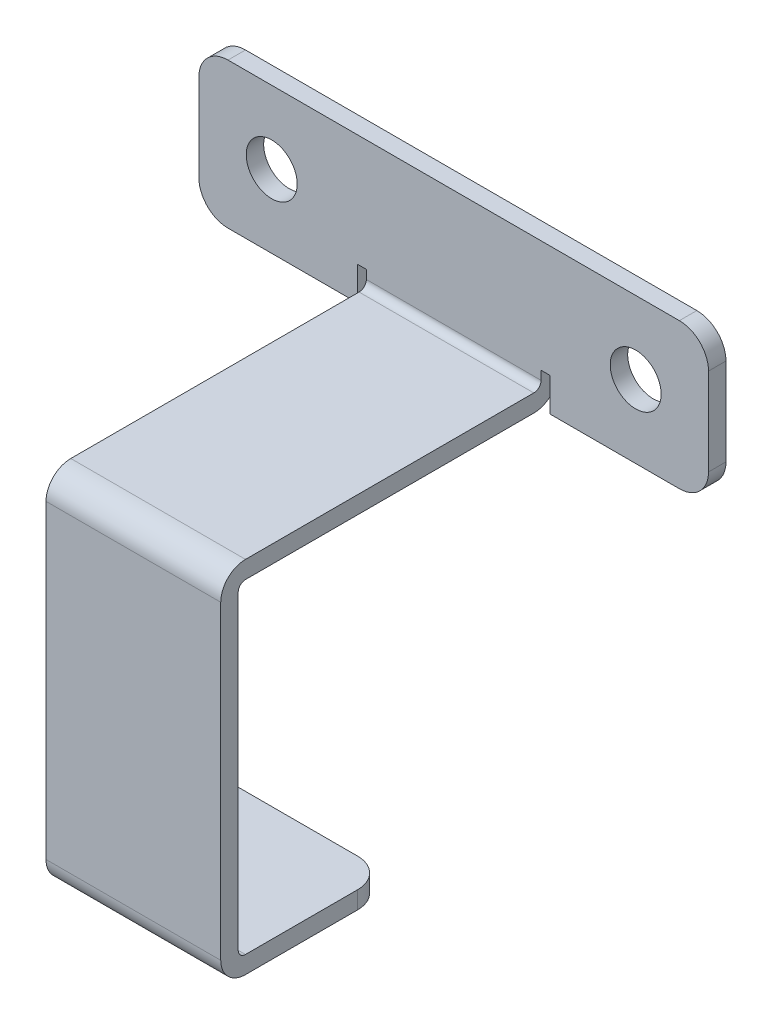
ISO-10303-21;
HEADER;
FILE_DESCRIPTION(('STEP AP214'),'2;1');
FILE_NAME('part.step','',(''),(''),'','','');
FILE_SCHEMA(('AUTOMOTIVE_DESIGN { 1 0 10303 214 1 1 1 1 }'));
ENDSEC;
DATA;
#1=APPLICATION_CONTEXT('core data for automotive mechanical design processes');
#2=APPLICATION_PROTOCOL_DEFINITION('international standard','automotive_design',2000,#1);
#3=PRODUCT_CONTEXT('',#1,'mechanical');
#4=PRODUCT('Part','Part','',(#3));
#5=PRODUCT_RELATED_PRODUCT_CATEGORY('part','',(#4));
#6=PRODUCT_DEFINITION_FORMATION('','',#4);
#7=PRODUCT_DEFINITION_CONTEXT('part definition',#1,'design');
#8=PRODUCT_DEFINITION('design','',#6,#7);
#9=PRODUCT_DEFINITION_SHAPE('','',#8);
#10=(LENGTH_UNIT() NAMED_UNIT(*) SI_UNIT(.MILLI.,.METRE.));
#11=(NAMED_UNIT(*) PLANE_ANGLE_UNIT() SI_UNIT($,.RADIAN.));
#12=(NAMED_UNIT(*) SI_UNIT($,.STERADIAN.) SOLID_ANGLE_UNIT());
#13=UNCERTAINTY_MEASURE_WITH_UNIT(LENGTH_MEASURE(1.E-05),#10,'distance_accuracy_value','');
#14=(GEOMETRIC_REPRESENTATION_CONTEXT(3) GLOBAL_UNCERTAINTY_ASSIGNED_CONTEXT((#13)) GLOBAL_UNIT_ASSIGNED_CONTEXT((#10,
#11,#12)) REPRESENTATION_CONTEXT('',''));
#15=CARTESIAN_POINT('',(0.,0.,0.));
#16=DIRECTION('',(0.,0.,1.));
#17=DIRECTION('',(1.,0.,0.));
#18=AXIS2_PLACEMENT_3D('',#15,#16,#17);
#19=CARTESIAN_POINT('',(5.9999999999994,-26.8,21.5));
#20=DIRECTION('',(-1.,1.20042864537595E-12,1.20042864537596E-12));
#21=DIRECTION('',(1.20042864537596E-12,0.,1.));
#22=AXIS2_PLACEMENT_3D('',#19,#20,#21);
#23=CYLINDRICAL_SURFACE('',#22,0.5);
#24=CARTESIAN_POINT('',(-5.9999999999994,-26.7999999999856,21.5000000000144));
#25=DIRECTION('',(1.,-1.20042864537595E-12,-1.20042864537596E-12));
#26=DIRECTION('',(1.20042864537596E-12,0.,1.));
#27=AXIS2_PLACEMENT_3D('',#24,#25,#26);
#28=CIRCLE('',#27,0.5);
#29=CARTESIAN_POINT('',(-5.9999999999994,-26.7999999999928,22.));
#30=VERTEX_POINT('',#29);
#31=CARTESIAN_POINT('',(-6.,-27.3,21.5000000000072));
#32=VERTEX_POINT('',#31);
#33=EDGE_CURVE('E455',#30,#32,#28,.T.);
#34=ORIENTED_EDGE('',*,*,#33,.F.);
#35=DIRECTION('',(-1.,0.,0.));
#36=VECTOR('',#35,1.);
#37=CARTESIAN_POINT('',(0.,-26.8,22.));
#38=LINE('',#37,#36);
#39=CARTESIAN_POINT('',(6.,-26.8,22.));
#40=VERTEX_POINT('',#39);
#41=EDGE_CURVE('E20',#40,#30,#38,.T.);
#42=ORIENTED_EDGE('',*,*,#41,.F.);
#43=CARTESIAN_POINT('',(5.9999999999994,-26.8,21.5));
#44=DIRECTION('',(-1.,1.20042864537595E-12,1.20042864537596E-12));
#45=DIRECTION('',(1.20042864537596E-12,0.,1.));
#46=AXIS2_PLACEMENT_3D('',#43,#44,#45);
#47=CIRCLE('',#46,0.5);
#48=CARTESIAN_POINT('',(5.9999999999994,-27.3,21.5));
#49=VERTEX_POINT('',#48);
#50=EDGE_CURVE('E541',#49,#40,#47,.T.);
#51=ORIENTED_EDGE('',*,*,#50,.F.);
#52=DIRECTION('',(1.,0.,0.));
#53=VECTOR('',#52,1.);
#54=CARTESIAN_POINT('',(0.,-27.3,21.5));
#55=LINE('',#54,#53);
#56=EDGE_CURVE('E343',#32,#49,#55,.T.);
#57=ORIENTED_EDGE('',*,*,#56,.F.);
#58=EDGE_LOOP('',(#34,#42,#51,#57));
#59=FACE_BOUND('',#58,.T.);
#60=ADVANCED_FACE('F17',(#59),#23,.F.);
#61=CARTESIAN_POINT('',(-4.,-28.5,13.7999999999994));
#62=DIRECTION('',(0.,1.,0.));
#63=DIRECTION('',(0.,0.,1.));
#64=AXIS2_PLACEMENT_3D('',#61,#62,#63);
#65=CYLINDRICAL_SURFACE('',#64,1.99999999999972);
#66=CARTESIAN_POINT('',(-4.,-27.3,13.7999999999994));
#67=DIRECTION('',(0.,1.,0.));
#68=DIRECTION('',(0.,0.,1.));
#69=AXIS2_PLACEMENT_3D('',#66,#67,#68);
#70=CIRCLE('',#69,1.99999999999972);
#71=CARTESIAN_POINT('',(-4.,-27.3,11.8));
#72=VERTEX_POINT('',#71);
#73=CARTESIAN_POINT('',(-6.,-27.3,13.7999999999997));
#74=VERTEX_POINT('',#73);
#75=EDGE_CURVE('E347',#72,#74,#70,.T.);
#76=ORIENTED_EDGE('',*,*,#75,.F.);
#77=DIRECTION('',(0.,-1.,0.));
#78=VECTOR('',#77,1.);
#79=CARTESIAN_POINT('',(-4.,-27.9,11.8));
#80=LINE('',#79,#78);
#81=CARTESIAN_POINT('',(-4.,-28.5,11.8));
#82=VERTEX_POINT('',#81);
#83=EDGE_CURVE('E11',#72,#82,#80,.T.);
#84=ORIENTED_EDGE('',*,*,#83,.T.);
#85=CARTESIAN_POINT('',(-4.,-28.5,13.7999999999994));
#86=DIRECTION('',(0.,1.,0.));
#87=DIRECTION('',(0.,0.,1.));
#88=AXIS2_PLACEMENT_3D('',#85,#86,#87);
#89=CIRCLE('',#88,1.99999999999972);
#90=CARTESIAN_POINT('',(-6.,-28.5,13.7999999999997));
#91=VERTEX_POINT('',#90);
#92=EDGE_CURVE('E381',#82,#91,#89,.T.);
#93=ORIENTED_EDGE('',*,*,#92,.T.);
#94=DIRECTION('',(0.,1.,0.));
#95=VECTOR('',#94,1.);
#96=CARTESIAN_POINT('',(-6.,-27.9,13.8));
#97=LINE('',#96,#95);
#98=EDGE_CURVE('E471',#91,#74,#97,.T.);
#99=ORIENTED_EDGE('',*,*,#98,.T.);
#100=EDGE_LOOP('',(#76,#84,#93,#99));
#101=FACE_BOUND('',#100,.T.);
#102=ADVANCED_FACE('F588',(#101),#65,.T.);
#103=CARTESIAN_POINT('',(4.,-28.5,13.7999999999994));
#104=DIRECTION('',(0.,1.,0.));
#105=DIRECTION('',(0.,0.,1.));
#106=AXIS2_PLACEMENT_3D('',#103,#104,#105);
#107=CYLINDRICAL_SURFACE('',#106,1.99999999999972);
#108=CARTESIAN_POINT('',(4.,-27.3,13.7999999999994));
#109=DIRECTION('',(0.,1.,0.));
#110=DIRECTION('',(0.,0.,1.));
#111=AXIS2_PLACEMENT_3D('',#108,#109,#110);
#112=CIRCLE('',#111,1.99999999999972);
#113=CARTESIAN_POINT('',(6.,-27.3,13.7999999999997));
#114=VERTEX_POINT('',#113);
#115=CARTESIAN_POINT('',(4.,-27.3,11.8));
#116=VERTEX_POINT('',#115);
#117=EDGE_CURVE('E346',#114,#116,#112,.T.);
#118=ORIENTED_EDGE('',*,*,#117,.F.);
#119=DIRECTION('',(0.,-1.,0.));
#120=VECTOR('',#119,1.);
#121=CARTESIAN_POINT('',(6.,-27.9,13.8));
#122=LINE('',#121,#120);
#123=CARTESIAN_POINT('',(6.,-28.5,13.7999999999997));
#124=VERTEX_POINT('',#123);
#125=EDGE_CURVE('E566',#114,#124,#122,.T.);
#126=ORIENTED_EDGE('',*,*,#125,.T.);
#127=CARTESIAN_POINT('',(4.,-28.5,13.7999999999994));
#128=DIRECTION('',(0.,1.,0.));
#129=DIRECTION('',(0.,0.,1.));
#130=AXIS2_PLACEMENT_3D('',#127,#128,#129);
#131=CIRCLE('',#130,1.99999999999972);
#132=CARTESIAN_POINT('',(4.,-28.5,11.8));
#133=VERTEX_POINT('',#132);
#134=EDGE_CURVE('E378',#124,#133,#131,.T.);
#135=ORIENTED_EDGE('',*,*,#134,.T.);
#136=DIRECTION('',(0.,1.,0.));
#137=VECTOR('',#136,1.);
#138=CARTESIAN_POINT('',(4.,-27.9,11.8));
#139=LINE('',#138,#137);
#140=EDGE_CURVE('E26',#133,#116,#139,.T.);
#141=ORIENTED_EDGE('',*,*,#140,.T.);
#142=EDGE_LOOP('',(#118,#126,#135,#141));
#143=FACE_BOUND('',#142,.T.);
#144=ADVANCED_FACE('F1411',(#143),#107,.T.);
#145=CARTESIAN_POINT('',(-4.,-27.3,11.8));
#146=DIRECTION('',(0.,0.,1.));
#147=DIRECTION('',(1.,0.,0.));
#148=AXIS2_PLACEMENT_3D('',#145,#146,#147);
#149=PLANE('',#148);
#150=ORIENTED_EDGE('',*,*,#140,.F.);
#151=DIRECTION('',(-1.,0.,0.));
#152=VECTOR('',#151,1.);
#153=CARTESIAN_POINT('',(0.,-28.5,11.8));
#154=LINE('',#153,#152);
#155=EDGE_CURVE('E387',#133,#82,#154,.T.);
#156=ORIENTED_EDGE('',*,*,#155,.T.);
#157=ORIENTED_EDGE('',*,*,#83,.F.);
#158=DIRECTION('',(-1.,0.,0.));
#159=VECTOR('',#158,1.);
#160=CARTESIAN_POINT('',(0.,-27.3,11.8));
#161=LINE('',#160,#159);
#162=EDGE_CURVE('E383',#116,#72,#161,.T.);
#163=ORIENTED_EDGE('',*,*,#162,.F.);
#164=EDGE_LOOP('',(#150,#156,#157,#163));
#165=FACE_BOUND('',#164,.T.);
#166=ADVANCED_FACE('F1402',(#165),#149,.F.);
#167=CARTESIAN_POINT('',(5.9999999999994,-5.5,21.5));
#168=DIRECTION('',(-1.,1.20042864537619E-12,1.20042864537584E-12));
#169=DIRECTION('',(1.20042864537584E-12,0.,1.));
#170=AXIS2_PLACEMENT_3D('',#167,#168,#169);
#171=CYLINDRICAL_SURFACE('',#170,0.500000000000046);
#172=CARTESIAN_POINT('',(-6.0000000000006,-5.4999999999856,21.5000000000143));
#173=DIRECTION('',(1.,-1.20042864537619E-12,-1.20042864537584E-12));
#174=DIRECTION('',(1.20042864537584E-12,0.,1.));
#175=AXIS2_PLACEMENT_3D('',#172,#173,#174);
#176=CIRCLE('',#175,0.500000000000046);
#177=CARTESIAN_POINT('',(-6.,-5.,21.5000000000071));
#178=VERTEX_POINT('',#177);
#179=CARTESIAN_POINT('',(-6.,-5.4999999999928,22.));
#180=VERTEX_POINT('',#179);
#181=EDGE_CURVE('E456',#178,#180,#176,.T.);
#182=ORIENTED_EDGE('',*,*,#181,.F.);
#183=DIRECTION('',(1.,0.,0.));
#184=VECTOR('',#183,1.);
#185=CARTESIAN_POINT('',(0.,-5.,21.5));
#186=LINE('',#185,#184);
#187=CARTESIAN_POINT('',(6.,-5.,21.5));
#188=VERTEX_POINT('',#187);
#189=EDGE_CURVE('E547',#178,#188,#186,.T.);
#190=ORIENTED_EDGE('',*,*,#189,.T.);
#191=CARTESIAN_POINT('',(5.9999999999994,-5.5,21.5));
#192=DIRECTION('',(-1.,1.20042864537619E-12,1.20042864537584E-12));
#193=DIRECTION('',(1.20042864537584E-12,0.,1.));
#194=AXIS2_PLACEMENT_3D('',#191,#192,#193);
#195=CIRCLE('',#194,0.500000000000046);
#196=CARTESIAN_POINT('',(6.,-5.5,22.));
#197=VERTEX_POINT('',#196);
#198=EDGE_CURVE('E551',#197,#188,#195,.T.);
#199=ORIENTED_EDGE('',*,*,#198,.F.);
#200=DIRECTION('',(1.,0.,0.));
#201=VECTOR('',#200,1.);
#202=CARTESIAN_POINT('',(0.,-5.5,22.));
#203=LINE('',#202,#201);
#204=EDGE_CURVE('E422',#180,#197,#203,.T.);
#205=ORIENTED_EDGE('',*,*,#204,.F.);
#206=EDGE_LOOP('',(#182,#190,#199,#205));
#207=FACE_BOUND('',#206,.T.);
#208=ADVANCED_FACE('F1393',(#207),#171,.F.);
#209=CARTESIAN_POINT('',(6.,-26.8,22.));
#210=DIRECTION('',(0.,0.,-1.));
#211=DIRECTION('',(0.,-1.,0.));
#212=AXIS2_PLACEMENT_3D('',#209,#210,#211);
#213=PLANE('',#212);
#214=DIRECTION('',(0.,-1.,0.));
#215=VECTOR('',#214,1.);
#216=CARTESIAN_POINT('',(-6.,-15.6,22.));
#217=LINE('',#216,#215);
#218=EDGE_CURVE('E451',#180,#30,#217,.T.);
#219=ORIENTED_EDGE('',*,*,#218,.F.);
#220=ORIENTED_EDGE('',*,*,#204,.T.);
#221=DIRECTION('',(0.,1.,0.));
#222=VECTOR('',#221,1.);
#223=CARTESIAN_POINT('',(6.,-15.6,22.));
#224=LINE('',#223,#222);
#225=EDGE_CURVE('E338',#40,#197,#224,.T.);
#226=ORIENTED_EDGE('',*,*,#225,.F.);
#227=ORIENTED_EDGE('',*,*,#41,.T.);
#228=EDGE_LOOP('',(#219,#220,#226,#227));
#229=FACE_BOUND('',#228,.T.);
#230=ADVANCED_FACE('F1219',(#229),#213,.T.);
#231=CARTESIAN_POINT('',(-6.,-27.3,11.8));
#232=DIRECTION('',(0.,1.,0.));
#233=DIRECTION('',(1.,0.,0.));
#234=AXIS2_PLACEMENT_3D('',#231,#232,#233);
#235=PLANE('',#234);
#236=ORIENTED_EDGE('',*,*,#162,.T.);
#237=ORIENTED_EDGE('',*,*,#75,.T.);
#238=DIRECTION('',(0.,0.,-1.));
#239=VECTOR('',#238,1.);
#240=CARTESIAN_POINT('',(-6.,-27.3,11.6));
#241=LINE('',#240,#239);
#242=EDGE_CURVE('E467',#32,#74,#241,.T.);
#243=ORIENTED_EDGE('',*,*,#242,.F.);
#244=ORIENTED_EDGE('',*,*,#56,.T.);
#245=DIRECTION('',(0.,0.,1.));
#246=VECTOR('',#245,1.);
#247=CARTESIAN_POINT('',(6.,-27.3,11.6));
#248=LINE('',#247,#246);
#249=EDGE_CURVE('E562',#114,#49,#248,.T.);
#250=ORIENTED_EDGE('',*,*,#249,.F.);
#251=ORIENTED_EDGE('',*,*,#117,.T.);
#252=EDGE_LOOP('',(#236,#237,#243,#244,#250,#251));
#253=FACE_BOUND('',#252,.T.);
#254=ADVANCED_FACE('F585',(#253),#235,.T.);
#255=CARTESIAN_POINT('',(-6.,-28.5,11.8));
#256=DIRECTION('',(0.,1.,0.));
#257=DIRECTION('',(1.,0.,0.));
#258=AXIS2_PLACEMENT_3D('',#255,#256,#257);
#259=PLANE('',#258);
#260=ORIENTED_EDGE('',*,*,#134,.F.);
#261=DIRECTION('',(0.,0.,-1.));
#262=VECTOR('',#261,1.);
#263=CARTESIAN_POINT('',(6.,-28.5,11.6));
#264=LINE('',#263,#262);
#265=CARTESIAN_POINT('',(6.,-28.5,21.5));
#266=VERTEX_POINT('',#265);
#267=EDGE_CURVE('E514',#266,#124,#264,.T.);
#268=ORIENTED_EDGE('',*,*,#267,.F.);
#269=DIRECTION('',(1.,0.,0.));
#270=VECTOR('',#269,1.);
#271=CARTESIAN_POINT('',(0.,-28.5,21.5));
#272=LINE('',#271,#270);
#273=CARTESIAN_POINT('',(-6.0000000000006,-28.5,21.5000000000021));
#274=VERTEX_POINT('',#273);
#275=EDGE_CURVE('E382',#274,#266,#272,.T.);
#276=ORIENTED_EDGE('',*,*,#275,.F.);
#277=DIRECTION('',(0.,0.,1.));
#278=VECTOR('',#277,1.);
#279=CARTESIAN_POINT('',(-6.,-28.5,11.6));
#280=LINE('',#279,#278);
#281=EDGE_CURVE('E533',#91,#274,#280,.T.);
#282=ORIENTED_EDGE('',*,*,#281,.F.);
#283=ORIENTED_EDGE('',*,*,#92,.F.);
#284=ORIENTED_EDGE('',*,*,#155,.F.);
#285=EDGE_LOOP('',(#260,#268,#276,#282,#283,#284));
#286=FACE_BOUND('',#285,.T.);
#287=ADVANCED_FACE('F1218',(#286),#259,.F.);
#288=CARTESIAN_POINT('',(5.9999999999994,-26.8,21.5));
#289=DIRECTION('',(-1.,3.53067248639986E-13,3.53067248639986E-13));
#290=DIRECTION('',(3.53067248639986E-13,0.,1.));
#291=AXIS2_PLACEMENT_3D('',#288,#289,#290);
#292=CYLINDRICAL_SURFACE('',#291,1.7);
#293=ORIENTED_EDGE('',*,*,#275,.T.);
#294=CARTESIAN_POINT('',(6.0000000000006,-26.8,21.5));
#295=DIRECTION('',(1.,-3.53067248639986E-13,-3.53067248639986E-13));
#296=DIRECTION('',(3.53067248639986E-13,0.,1.));
#297=AXIS2_PLACEMENT_3D('',#294,#295,#296);
#298=CIRCLE('',#297,1.7);
#299=CARTESIAN_POINT('',(6.0000000000006,-26.8,23.2));
#300=VERTEX_POINT('',#299);
#301=EDGE_CURVE('E479',#300,#266,#298,.T.);
#302=ORIENTED_EDGE('',*,*,#301,.F.);
#303=DIRECTION('',(-1.,0.,0.));
#304=VECTOR('',#303,1.);
#305=CARTESIAN_POINT('',(0.,-26.8,23.2));
#306=LINE('',#305,#304);
#307=CARTESIAN_POINT('',(-6.,-26.7999999999979,23.2));
#308=VERTEX_POINT('',#307);
#309=EDGE_CURVE('E439',#300,#308,#306,.T.);
#310=ORIENTED_EDGE('',*,*,#309,.T.);
#311=CARTESIAN_POINT('',(-6.0000000000006,-26.7999999999958,21.5000000000042));
#312=DIRECTION('',(-1.,3.53067248639986E-13,3.53067248639986E-13));
#313=DIRECTION('',(3.53067248639986E-13,0.,1.));
#314=AXIS2_PLACEMENT_3D('',#311,#312,#313);
#315=CIRCLE('',#314,1.7);
#316=EDGE_CURVE('E534',#274,#308,#315,.T.);
#317=ORIENTED_EDGE('',*,*,#316,.F.);
#318=EDGE_LOOP('',(#293,#302,#310,#317));
#319=FACE_BOUND('',#318,.T.);
#320=ADVANCED_FACE('F1368',(#319),#292,.T.);
#321=CARTESIAN_POINT('',(6.,-26.8,23.2));
#322=DIRECTION('',(0.,0.,-1.));
#323=DIRECTION('',(0.,-1.,0.));
#324=AXIS2_PLACEMENT_3D('',#321,#322,#323);
#325=PLANE('',#324);
#326=DIRECTION('',(0.,1.,0.));
#327=VECTOR('',#326,1.);
#328=CARTESIAN_POINT('',(-6.,-15.6,23.2));
#329=LINE('',#328,#327);
#330=CARTESIAN_POINT('',(-6.,-5.49999999999788,23.2));
#331=VERTEX_POINT('',#330);
#332=EDGE_CURVE('E497',#308,#331,#329,.T.);
#333=ORIENTED_EDGE('',*,*,#332,.F.);
#334=ORIENTED_EDGE('',*,*,#309,.F.);
#335=DIRECTION('',(0.,-1.,0.));
#336=VECTOR('',#335,1.);
#337=CARTESIAN_POINT('',(6.,-15.6,23.2));
#338=LINE('',#337,#336);
#339=CARTESIAN_POINT('',(6.,-5.5,23.2));
#340=VERTEX_POINT('',#339);
#341=EDGE_CURVE('E475',#340,#300,#338,.T.);
#342=ORIENTED_EDGE('',*,*,#341,.F.);
#343=DIRECTION('',(1.,0.,0.));
#344=VECTOR('',#343,1.);
#345=CARTESIAN_POINT('',(0.,-5.5,23.2));
#346=LINE('',#345,#344);
#347=EDGE_CURVE('E572',#331,#340,#346,.T.);
#348=ORIENTED_EDGE('',*,*,#347,.F.);
#349=EDGE_LOOP('',(#333,#334,#342,#348));
#350=FACE_BOUND('',#349,.T.);
#351=ADVANCED_FACE('F1359',(#350),#325,.F.);
#352=CARTESIAN_POINT('',(5.9999999999994,-5.5,21.5));
#353=DIRECTION('',(-1.,3.53067248639997E-13,3.53067248639986E-13));
#354=DIRECTION('',(-3.53067248639997E-13,-1.,0.));
#355=AXIS2_PLACEMENT_3D('',#352,#353,#354);
#356=CYLINDRICAL_SURFACE('',#355,1.69999999999995);
#357=ORIENTED_EDGE('',*,*,#347,.T.);
#358=CARTESIAN_POINT('',(5.9999999999994,-5.5,21.5));
#359=DIRECTION('',(1.,-3.53067248639997E-13,-3.53067248639986E-13));
#360=DIRECTION('',(-3.53067248639997E-13,-1.,0.));
#361=AXIS2_PLACEMENT_3D('',#358,#359,#360);
#362=CIRCLE('',#361,1.69999999999995);
#363=CARTESIAN_POINT('',(6.,-3.80000000000005,21.5));
#364=VERTEX_POINT('',#363);
#365=EDGE_CURVE('E480',#364,#340,#362,.T.);
#366=ORIENTED_EDGE('',*,*,#365,.F.);
#367=DIRECTION('',(1.,0.,0.));
#368=VECTOR('',#367,1.);
#369=CARTESIAN_POINT('',(0.,-3.8000000000001,21.5));
#370=LINE('',#369,#368);
#371=CARTESIAN_POINT('',(-6.,-3.8000000000001,21.5000000000021));
#372=VERTEX_POINT('',#371);
#373=EDGE_CURVE('E337',#372,#364,#370,.T.);
#374=ORIENTED_EDGE('',*,*,#373,.F.);
#375=CARTESIAN_POINT('',(-6.0000000000006,-5.49999999999576,21.5000000000042));
#376=DIRECTION('',(-1.,3.53067248639997E-13,3.53067248639986E-13));
#377=DIRECTION('',(-3.53067248639997E-13,-1.,0.));
#378=AXIS2_PLACEMENT_3D('',#375,#376,#377);
#379=CIRCLE('',#378,1.69999999999995);
#380=EDGE_CURVE('E492',#331,#372,#379,.T.);
#381=ORIENTED_EDGE('',*,*,#380,.F.);
#382=EDGE_LOOP('',(#357,#366,#374,#381));
#383=FACE_BOUND('',#382,.T.);
#384=ADVANCED_FACE('F1350',(#383),#356,.T.);
#385=CARTESIAN_POINT('',(-6.,-3.8,1.7));
#386=DIRECTION('',(0.,1.,0.));
#387=DIRECTION('',(0.,0.,-1.));
#388=AXIS2_PLACEMENT_3D('',#385,#386,#387);
#389=PLANE('',#388);
#390=DIRECTION('',(0.,0.,1.));
#391=VECTOR('',#390,1.);
#392=CARTESIAN_POINT('',(6.,-3.8,11.6));
#393=LINE('',#392,#391);
#394=CARTESIAN_POINT('',(6.,-3.8,1.69999999999399));
#395=VERTEX_POINT('',#394);
#396=EDGE_CURVE('E558',#395,#364,#393,.T.);
#397=ORIENTED_EDGE('',*,*,#396,.F.);
#398=DIRECTION('',(-1.,0.,0.));
#399=VECTOR('',#398,1.);
#400=CARTESIAN_POINT('',(0.,-3.8,1.7));
#401=LINE('',#400,#399);
#402=CARTESIAN_POINT('',(-5.9999999999995,-3.80000000000007,1.7));
#403=VERTEX_POINT('',#402);
#404=EDGE_CURVE('E334',#395,#403,#401,.T.);
#405=ORIENTED_EDGE('',*,*,#404,.T.);
#406=DIRECTION('',(0.,0.,-1.));
#407=VECTOR('',#406,1.);
#408=CARTESIAN_POINT('',(-6.,-3.8000000000001,11.6));
#409=LINE('',#408,#407);
#410=EDGE_CURVE('E517',#372,#403,#409,.T.);
#411=ORIENTED_EDGE('',*,*,#410,.F.);
#412=ORIENTED_EDGE('',*,*,#373,.T.);
#413=EDGE_LOOP('',(#397,#405,#411,#412));
#414=FACE_BOUND('',#413,.T.);
#415=ADVANCED_FACE('F1174',(#414),#389,.T.);
#416=CARTESIAN_POINT('',(-6.0000000000005,-3.3,1.7));
#417=DIRECTION('',(1.,1.00093544563862E-12,-1.00093544563862E-12));
#418=DIRECTION('',(-1.00093544563862E-12,1.,0.));
#419=AXIS2_PLACEMENT_3D('',#416,#417,#418);
#420=CYLINDRICAL_SURFACE('',#419,0.5);
#421=CARTESIAN_POINT('',(5.9999999999995,-3.29999999998799,1.69999999998799));
#422=DIRECTION('',(-1.,-1.00093544563862E-12,1.00093544563862E-12));
#423=DIRECTION('',(-1.00093544563862E-12,1.,0.));
#424=AXIS2_PLACEMENT_3D('',#421,#422,#423);
#425=CIRCLE('',#424,0.5);
#426=CARTESIAN_POINT('',(5.9999999999995,-3.299999999994,1.2));
#427=VERTEX_POINT('',#426);
#428=EDGE_CURVE('E554',#427,#395,#425,.T.);
#429=ORIENTED_EDGE('',*,*,#428,.F.);
#430=DIRECTION('',(1.,0.,0.));
#431=VECTOR('',#430,1.);
#432=CARTESIAN_POINT('',(0.,-3.3,1.2));
#433=LINE('',#432,#431);
#434=CARTESIAN_POINT('',(-6.,-3.3,1.2));
#435=VERTEX_POINT('',#434);
#436=EDGE_CURVE('E506',#435,#427,#433,.T.);
#437=ORIENTED_EDGE('',*,*,#436,.F.);
#438=CARTESIAN_POINT('',(-5.9999999999995,-3.3,1.7));
#439=DIRECTION('',(1.,1.00093544563862E-12,-1.00093544563862E-12));
#440=DIRECTION('',(-1.00093544563862E-12,1.,0.));
#441=AXIS2_PLACEMENT_3D('',#438,#439,#440);
#442=CIRCLE('',#441,0.5);
#443=EDGE_CURVE('E326',#403,#435,#442,.T.);
#444=ORIENTED_EDGE('',*,*,#443,.F.);
#445=ORIENTED_EDGE('',*,*,#404,.F.);
#446=EDGE_LOOP('',(#429,#437,#444,#445));
#447=FACE_BOUND('',#446,.T.);
#448=ADVANCED_FACE('F1170',(#447),#420,.F.);
#449=CARTESIAN_POINT('',(6.,-28.5,0.));
#450=DIRECTION('',(1.,0.,0.));
#451=DIRECTION('',(0.,1.,0.));
#452=AXIS2_PLACEMENT_3D('',#449,#450,#451);
#453=PLANE('',#452);
#454=ORIENTED_EDGE('',*,*,#198,.T.);
#455=DIRECTION('',(0.,0.,-1.));
#456=VECTOR('',#455,1.);
#457=CARTESIAN_POINT('',(6.,-5.,11.6));
#458=LINE('',#457,#456);
#459=CARTESIAN_POINT('',(6.0000000000005,-5.,1.69999999999823));
#460=VERTEX_POINT('',#459);
#461=EDGE_CURVE('E496',#188,#460,#458,.T.);
#462=ORIENTED_EDGE('',*,*,#461,.T.);
#463=CARTESIAN_POINT('',(6.0000000000005,-3.29999999999646,1.69999999999647));
#464=DIRECTION('',(-1.,-2.94392778129005E-13,2.94392778129005E-13));
#465=DIRECTION('',(-2.94392778129005E-13,0.,-1.));
#466=AXIS2_PLACEMENT_3D('',#463,#464,#465);
#467=CIRCLE('',#466,1.7);
#468=CARTESIAN_POINT('',(6.,-3.29999999999824,0.));
#469=VERTEX_POINT('',#468);
#470=EDGE_CURVE('E298',#469,#460,#467,.T.);
#471=ORIENTED_EDGE('',*,*,#470,.F.);
#472=DIRECTION('',(0.,1.,0.));
#473=VECTOR('',#472,1.);
#474=CARTESIAN_POINT('',(6.,-15.6,0.));
#475=LINE('',#474,#473);
#476=CARTESIAN_POINT('',(6.,-2.7,0.));
#477=VERTEX_POINT('',#476);
#478=EDGE_CURVE('E322',#469,#477,#475,.T.);
#479=ORIENTED_EDGE('',*,*,#478,.T.);
#480=DIRECTION('',(0.,0.,1.));
#481=VECTOR('',#480,1.);
#482=CARTESIAN_POINT('',(6.,-2.7,11.6));
#483=LINE('',#482,#481);
#484=CARTESIAN_POINT('',(6.,-2.7,1.2));
#485=VERTEX_POINT('',#484);
#486=EDGE_CURVE('E410',#477,#485,#483,.T.);
#487=ORIENTED_EDGE('',*,*,#486,.T.);
#488=DIRECTION('',(0.,1.,0.));
#489=VECTOR('',#488,1.);
#490=CARTESIAN_POINT('',(6.,0.,1.2));
#491=LINE('',#490,#489);
#492=EDGE_CURVE('E510',#427,#485,#491,.T.);
#493=ORIENTED_EDGE('',*,*,#492,.F.);
#494=ORIENTED_EDGE('',*,*,#428,.T.);
#495=ORIENTED_EDGE('',*,*,#396,.T.);
#496=ORIENTED_EDGE('',*,*,#365,.T.);
#497=ORIENTED_EDGE('',*,*,#341,.T.);
#498=ORIENTED_EDGE('',*,*,#301,.T.);
#499=ORIENTED_EDGE('',*,*,#267,.T.);
#500=ORIENTED_EDGE('',*,*,#125,.F.);
#501=ORIENTED_EDGE('',*,*,#249,.T.);
#502=ORIENTED_EDGE('',*,*,#50,.T.);
#503=ORIENTED_EDGE('',*,*,#225,.T.);
#504=EDGE_LOOP('',(#454,#462,#471,#479,#487,#493,#494,#495,#496,#497,#498,#499,#500,#501,#502,#503));
#505=FACE_BOUND('',#504,.T.);
#506=ADVANCED_FACE('F602',(#505),#453,.T.);
#507=CARTESIAN_POINT('',(-6.,-5.,1.7));
#508=DIRECTION('',(0.,1.,0.));
#509=DIRECTION('',(1.,0.,0.));
#510=AXIS2_PLACEMENT_3D('',#507,#508,#509);
#511=PLANE('',#510);
#512=ORIENTED_EDGE('',*,*,#461,.F.);
#513=ORIENTED_EDGE('',*,*,#189,.F.);
#514=DIRECTION('',(0.,0.,1.));
#515=VECTOR('',#514,1.);
#516=CARTESIAN_POINT('',(-6.,-5.,11.6));
#517=LINE('',#516,#515);
#518=CARTESIAN_POINT('',(-6.,-5.,1.7));
#519=VERTEX_POINT('',#518);
#520=EDGE_CURVE('E520',#519,#178,#517,.T.);
#521=ORIENTED_EDGE('',*,*,#520,.F.);
#522=DIRECTION('',(-1.,0.,0.));
#523=VECTOR('',#522,1.);
#524=CARTESIAN_POINT('',(0.,-5.,1.7));
#525=LINE('',#524,#523);
#526=EDGE_CURVE('E418',#460,#519,#525,.T.);
#527=ORIENTED_EDGE('',*,*,#526,.F.);
#528=EDGE_LOOP('',(#512,#513,#521,#527));
#529=FACE_BOUND('',#528,.T.);
#530=ADVANCED_FACE('F1327',(#529),#511,.F.);
#531=CARTESIAN_POINT('',(-6.,-2.7,0.));
#532=DIRECTION('',(-1.,0.,0.));
#533=DIRECTION('',(0.,0.,1.));
#534=AXIS2_PLACEMENT_3D('',#531,#532,#533);
#535=PLANE('',#534);
#536=ORIENTED_EDGE('',*,*,#410,.T.);
#537=ORIENTED_EDGE('',*,*,#443,.T.);
#538=DIRECTION('',(0.,-1.,0.));
#539=VECTOR('',#538,1.);
#540=CARTESIAN_POINT('',(-6.,0.,1.2));
#541=LINE('',#540,#539);
#542=CARTESIAN_POINT('',(-6.,-2.7,1.2));
#543=VERTEX_POINT('',#542);
#544=EDGE_CURVE('E292',#543,#435,#541,.T.);
#545=ORIENTED_EDGE('',*,*,#544,.F.);
#546=DIRECTION('',(0.,0.,1.));
#547=VECTOR('',#546,1.);
#548=CARTESIAN_POINT('',(-6.,-2.7,0.6));
#549=LINE('',#548,#547);
#550=CARTESIAN_POINT('',(-6.,-2.7,0.));
#551=VERTEX_POINT('',#550);
#552=EDGE_CURVE('E283',#551,#543,#549,.T.);
#553=ORIENTED_EDGE('',*,*,#552,.F.);
#554=DIRECTION('',(0.,-1.,0.));
#555=VECTOR('',#554,1.);
#556=CARTESIAN_POINT('',(-6.,-15.6,0.));
#557=LINE('',#556,#555);
#558=CARTESIAN_POINT('',(-6.0000000000005,-3.3,0.));
#559=VERTEX_POINT('',#558);
#560=EDGE_CURVE('E289',#551,#559,#557,.T.);
#561=ORIENTED_EDGE('',*,*,#560,.T.);
#562=CARTESIAN_POINT('',(-6.0000000000005,-3.3,1.7));
#563=DIRECTION('',(1.,2.94392778129005E-13,-2.94392778129005E-13));
#564=DIRECTION('',(-2.94392778129005E-13,0.,-1.));
#565=AXIS2_PLACEMENT_3D('',#562,#563,#564);
#566=CIRCLE('',#565,1.7);
#567=EDGE_CURVE('E414',#519,#559,#566,.T.);
#568=ORIENTED_EDGE('',*,*,#567,.F.);
#569=ORIENTED_EDGE('',*,*,#520,.T.);
#570=ORIENTED_EDGE('',*,*,#181,.T.);
#571=ORIENTED_EDGE('',*,*,#218,.T.);
#572=ORIENTED_EDGE('',*,*,#33,.T.);
#573=ORIENTED_EDGE('',*,*,#242,.T.);
#574=ORIENTED_EDGE('',*,*,#98,.F.);
#575=ORIENTED_EDGE('',*,*,#281,.T.);
#576=ORIENTED_EDGE('',*,*,#316,.T.);
#577=ORIENTED_EDGE('',*,*,#332,.T.);
#578=ORIENTED_EDGE('',*,*,#380,.T.);
#579=EDGE_LOOP('',(#536,#537,#545,#553,#561,#568,#569,#570,#571,#572,#573,#574,#575,#576,#577,#578));
#580=FACE_BOUND('',#579,.T.);
#581=ADVANCED_FACE('F286',(#580),#535,.T.);
#582=CARTESIAN_POINT('',(-17.5,-5.,1.2));
#583=DIRECTION('',(0.,0.,1.));
#584=DIRECTION('',(1.,0.,0.));
#585=AXIS2_PLACEMENT_3D('',#582,#583,#584);
#586=PLANE('',#585);
#587=CARTESIAN_POINT('',(-12.5,0.,1.2));
#588=DIRECTION('',(0.,0.,-1.));
#589=DIRECTION('',(1.,0.,0.));
#590=AXIS2_PLACEMENT_3D('',#587,#588,#589);
#591=CIRCLE('',#590,1.75);
#592=CARTESIAN_POINT('',(-10.75,0.,1.2));
#593=VERTEX_POINT('',#592);
#594=EDGE_CURVE('E612',#593,#593,#591,.T.);
#595=ORIENTED_EDGE('',*,*,#594,.T.);
#596=EDGE_LOOP('',(#595));
#597=FACE_BOUND('',#596,.T.);
#598=CARTESIAN_POINT('',(12.5,0.,1.2));
#599=DIRECTION('',(0.,0.,-1.));
#600=DIRECTION('',(1.,0.,0.));
#601=AXIS2_PLACEMENT_3D('',#598,#599,#600);
#602=CIRCLE('',#601,1.75);
#603=CARTESIAN_POINT('',(14.25,0.,1.2));
#604=VERTEX_POINT('',#603);
#605=EDGE_CURVE('E689',#604,#604,#602,.T.);
#606=ORIENTED_EDGE('',*,*,#605,.T.);
#607=EDGE_LOOP('',(#606));
#608=FACE_BOUND('',#607,.T.);
#609=DIRECTION('',(-1.,0.,0.));
#610=VECTOR('',#609,1.);
#611=CARTESIAN_POINT('',(-6.29999999999975,-2.7,1.2));
#612=LINE('',#611,#610);
#613=CARTESIAN_POINT('',(-6.5999999999995,-2.7,1.2));
#614=VERTEX_POINT('',#613);
#615=EDGE_CURVE('E297',#543,#614,#612,.T.);
#616=ORIENTED_EDGE('',*,*,#615,.F.);
#617=ORIENTED_EDGE('',*,*,#544,.T.);
#618=ORIENTED_EDGE('',*,*,#436,.T.);
#619=ORIENTED_EDGE('',*,*,#492,.T.);
#620=DIRECTION('',(-1.,0.,0.));
#621=VECTOR('',#620,1.);
#622=CARTESIAN_POINT('',(6.3000000000003,-2.7,1.2));
#623=LINE('',#622,#621);
#624=CARTESIAN_POINT('',(6.6000000000006,-2.7,1.2));
#625=VERTEX_POINT('',#624);
#626=EDGE_CURVE('E401',#625,#485,#623,.T.);
#627=ORIENTED_EDGE('',*,*,#626,.F.);
#628=DIRECTION('',(0.,1.,0.));
#629=VECTOR('',#628,1.);
#630=CARTESIAN_POINT('',(6.6000000000006,-3.85,1.2));
#631=LINE('',#630,#629);
#632=CARTESIAN_POINT('',(6.6000000000006,-5.,1.2));
#633=VERTEX_POINT('',#632);
#634=EDGE_CURVE('E360',#633,#625,#631,.T.);
#635=ORIENTED_EDGE('',*,*,#634,.F.);
#636=DIRECTION('',(1.,0.,0.));
#637=VECTOR('',#636,1.);
#638=CARTESIAN_POINT('',(11.0500000000003,-5.,1.2));
#639=LINE('',#638,#637);
#640=CARTESIAN_POINT('',(15.5,-5.,1.2));
#641=VERTEX_POINT('',#640);
#642=EDGE_CURVE('E356',#633,#641,#639,.T.);
#643=ORIENTED_EDGE('',*,*,#642,.T.);
#644=CARTESIAN_POINT('',(15.5,-2.999999999999,1.2));
#645=DIRECTION('',(0.,0.,-1.));
#646=DIRECTION('',(0.,1.,0.));
#647=AXIS2_PLACEMENT_3D('',#644,#645,#646);
#648=CIRCLE('',#647,1.99999999999953);
#649=CARTESIAN_POINT('',(17.5,-2.9999999999995,1.2));
#650=VERTEX_POINT('',#649);
#651=EDGE_CURVE('E501',#650,#641,#648,.T.);
#652=ORIENTED_EDGE('',*,*,#651,.F.);
#653=DIRECTION('',(0.,1.,0.));
#654=VECTOR('',#653,1.);
#655=CARTESIAN_POINT('',(17.5,0.,1.2));
#656=LINE('',#655,#654);
#657=CARTESIAN_POINT('',(17.5,3.,1.2));
#658=VERTEX_POINT('',#657);
#659=EDGE_CURVE('E393',#650,#658,#656,.T.);
#660=ORIENTED_EDGE('',*,*,#659,.T.);
#661=CARTESIAN_POINT('',(15.5,3.,1.2));
#662=DIRECTION('',(0.,0.,-1.));
#663=DIRECTION('',(0.,1.,0.));
#664=AXIS2_PLACEMENT_3D('',#661,#662,#663);
#665=CIRCLE('',#664,2.);
#666=CARTESIAN_POINT('',(15.5,5.,1.2));
#667=VERTEX_POINT('',#666);
#668=EDGE_CURVE('E486',#667,#658,#665,.T.);
#669=ORIENTED_EDGE('',*,*,#668,.F.);
#670=DIRECTION('',(-1.,0.,0.));
#671=VECTOR('',#670,1.);
#672=CARTESIAN_POINT('',(0.,5.,1.2));
#673=LINE('',#672,#671);
#674=CARTESIAN_POINT('',(-15.5,5.,1.2));
#675=VERTEX_POINT('',#674);
#676=EDGE_CURVE('E402',#667,#675,#673,.T.);
#677=ORIENTED_EDGE('',*,*,#676,.T.);
#678=CARTESIAN_POINT('',(-15.5,3.,1.2));
#679=DIRECTION('',(0.,0.,-1.));
#680=DIRECTION('',(-1.,0.,0.));
#681=AXIS2_PLACEMENT_3D('',#678,#679,#680);
#682=CIRCLE('',#681,2.);
#683=CARTESIAN_POINT('',(-17.5,3.,1.2));
#684=VERTEX_POINT('',#683);
#685=EDGE_CURVE('E466',#684,#675,#682,.T.);
#686=ORIENTED_EDGE('',*,*,#685,.F.);
#687=DIRECTION('',(0.,-1.,0.));
#688=VECTOR('',#687,1.);
#689=CARTESIAN_POINT('',(-17.5,0.,1.2));
#690=LINE('',#689,#688);
#691=CARTESIAN_POINT('',(-17.5,-2.9999999999995,1.2));
#692=VERTEX_POINT('',#691);
#693=EDGE_CURVE('E459',#684,#692,#690,.T.);
#694=ORIENTED_EDGE('',*,*,#693,.T.);
#695=CARTESIAN_POINT('',(-15.5,-2.999999999999,1.2));
#696=DIRECTION('',(0.,0.,-1.));
#697=DIRECTION('',(-1.,0.,0.));
#698=AXIS2_PLACEMENT_3D('',#695,#696,#697);
#699=CIRCLE('',#698,1.99999999999953);
#700=CARTESIAN_POINT('',(-15.5,-5.,1.2));
#701=VERTEX_POINT('',#700);
#702=EDGE_CURVE('E446',#701,#692,#699,.T.);
#703=ORIENTED_EDGE('',*,*,#702,.F.);
#704=DIRECTION('',(1.,0.,0.));
#705=VECTOR('',#704,1.);
#706=CARTESIAN_POINT('',(-11.0499999999997,-5.,1.2));
#707=LINE('',#706,#705);
#708=CARTESIAN_POINT('',(-6.5999999999995,-5.,1.2));
#709=VERTEX_POINT('',#708);
#710=EDGE_CURVE('E436',#701,#709,#707,.T.);
#711=ORIENTED_EDGE('',*,*,#710,.T.);
#712=DIRECTION('',(0.,-1.,0.));
#713=VECTOR('',#712,1.);
#714=CARTESIAN_POINT('',(-6.5999999999995,-3.85,1.2));
#715=LINE('',#714,#713);
#716=EDGE_CURVE('E429',#614,#709,#715,.T.);
#717=ORIENTED_EDGE('',*,*,#716,.F.);
#718=EDGE_LOOP('',(#616,#617,#618,#619,#627,#635,#643,#652,#660,#669,#677,#686,#694,#703,#711,#717));
#719=FACE_BOUND('',#718,.T.);
#720=ADVANCED_FACE('F641',(#597,#608,#719),#586,.T.);
#721=CARTESIAN_POINT('',(15.5,-2.999999999999,1.2));
#722=DIRECTION('',(0.,0.,-1.));
#723=DIRECTION('',(0.,1.,0.));
#724=AXIS2_PLACEMENT_3D('',#721,#722,#723);
#725=CYLINDRICAL_SURFACE('',#724,1.99999999999953);
#726=CARTESIAN_POINT('',(15.5,-2.999999999999,0.));
#727=DIRECTION('',(0.,0.,1.));
#728=DIRECTION('',(0.,1.,0.));
#729=AXIS2_PLACEMENT_3D('',#726,#727,#728);
#730=CIRCLE('',#729,1.99999999999953);
#731=CARTESIAN_POINT('',(15.5,-5.,0.));
#732=VERTEX_POINT('',#731);
#733=CARTESIAN_POINT('',(17.5,-2.9999999999995,0.));
#734=VERTEX_POINT('',#733);
#735=EDGE_CURVE('E369',#732,#734,#730,.T.);
#736=ORIENTED_EDGE('',*,*,#735,.T.);
#737=DIRECTION('',(0.,0.,1.));
#738=VECTOR('',#737,1.);
#739=CARTESIAN_POINT('',(17.5,-3.,0.6));
#740=LINE('',#739,#738);
#741=EDGE_CURVE('E396',#734,#650,#740,.T.);
#742=ORIENTED_EDGE('',*,*,#741,.T.);
#743=ORIENTED_EDGE('',*,*,#651,.T.);
#744=DIRECTION('',(0.,0.,-1.));
#745=VECTOR('',#744,1.);
#746=CARTESIAN_POINT('',(15.5,-5.,0.6));
#747=LINE('',#746,#745);
#748=EDGE_CURVE('E361',#641,#732,#747,.T.);
#749=ORIENTED_EDGE('',*,*,#748,.T.);
#750=EDGE_LOOP('',(#736,#742,#743,#749));
#751=FACE_BOUND('',#750,.T.);
#752=ADVANCED_FACE('F667',(#751),#725,.T.);
#753=CARTESIAN_POINT('',(17.5,3.,0.));
#754=DIRECTION('',(-1.,0.,0.));
#755=DIRECTION('',(0.,0.,1.));
#756=AXIS2_PLACEMENT_3D('',#753,#754,#755);
#757=PLANE('',#756);
#758=DIRECTION('',(0.,0.,-1.));
#759=VECTOR('',#758,1.);
#760=CARTESIAN_POINT('',(17.5,3.,0.6));
#761=LINE('',#760,#759);
#762=CARTESIAN_POINT('',(17.5,3.,0.));
#763=VERTEX_POINT('',#762);
#764=EDGE_CURVE('E397',#658,#763,#761,.T.);
#765=ORIENTED_EDGE('',*,*,#764,.F.);
#766=ORIENTED_EDGE('',*,*,#659,.F.);
#767=ORIENTED_EDGE('',*,*,#741,.F.);
#768=DIRECTION('',(0.,1.,0.));
#769=VECTOR('',#768,1.);
#770=CARTESIAN_POINT('',(17.5,0.,0.));
#771=LINE('',#770,#769);
#772=EDGE_CURVE('E365',#734,#763,#771,.T.);
#773=ORIENTED_EDGE('',*,*,#772,.T.);
#774=EDGE_LOOP('',(#765,#766,#767,#773));
#775=FACE_BOUND('',#774,.T.);
#776=ADVANCED_FACE('F665',(#775),#757,.F.);
#777=CARTESIAN_POINT('',(15.5,3.,1.2));
#778=DIRECTION('',(0.,0.,-1.));
#779=DIRECTION('',(0.,1.,0.));
#780=AXIS2_PLACEMENT_3D('',#777,#778,#779);
#781=CYLINDRICAL_SURFACE('',#780,2.);
#782=CARTESIAN_POINT('',(15.5,3.,0.));
#783=DIRECTION('',(0.,0.,1.));
#784=DIRECTION('',(0.,1.,0.));
#785=AXIS2_PLACEMENT_3D('',#782,#783,#784);
#786=CIRCLE('',#785,2.);
#787=CARTESIAN_POINT('',(15.5,5.,0.));
#788=VERTEX_POINT('',#787);
#789=EDGE_CURVE('E355',#763,#788,#786,.T.);
#790=ORIENTED_EDGE('',*,*,#789,.T.);
#791=DIRECTION('',(0.,0.,1.));
#792=VECTOR('',#791,1.);
#793=CARTESIAN_POINT('',(15.5,5.,0.6));
#794=LINE('',#793,#792);
#795=EDGE_CURVE('E405',#788,#667,#794,.T.);
#796=ORIENTED_EDGE('',*,*,#795,.T.);
#797=ORIENTED_EDGE('',*,*,#668,.T.);
#798=ORIENTED_EDGE('',*,*,#764,.T.);
#799=EDGE_LOOP('',(#790,#796,#797,#798));
#800=FACE_BOUND('',#799,.T.);
#801=ADVANCED_FACE('F661',(#800),#781,.T.);
#802=CARTESIAN_POINT('',(-15.5,5.,0.));
#803=DIRECTION('',(0.,-1.,0.));
#804=DIRECTION('',(0.,0.,-1.));
#805=AXIS2_PLACEMENT_3D('',#802,#803,#804);
#806=PLANE('',#805);
#807=DIRECTION('',(0.,0.,-1.));
#808=VECTOR('',#807,1.);
#809=CARTESIAN_POINT('',(-15.5,5.,0.6));
#810=LINE('',#809,#808);
#811=CARTESIAN_POINT('',(-15.5,5.,0.));
#812=VERTEX_POINT('',#811);
#813=EDGE_CURVE('E406',#675,#812,#810,.T.);
#814=ORIENTED_EDGE('',*,*,#813,.F.);
#815=ORIENTED_EDGE('',*,*,#676,.F.);
#816=ORIENTED_EDGE('',*,*,#795,.F.);
#817=DIRECTION('',(-1.,0.,0.));
#818=VECTOR('',#817,1.);
#819=CARTESIAN_POINT('',(0.,5.,0.));
#820=LINE('',#819,#818);
#821=EDGE_CURVE('E351',#788,#812,#820,.T.);
#822=ORIENTED_EDGE('',*,*,#821,.T.);
#823=EDGE_LOOP('',(#814,#815,#816,#822));
#824=FACE_BOUND('',#823,.T.);
#825=ADVANCED_FACE('F656',(#824),#806,.F.);
#826=CARTESIAN_POINT('',(-15.5,3.,1.2));
#827=DIRECTION('',(0.,0.,-1.));
#828=DIRECTION('',(-1.,0.,0.));
#829=AXIS2_PLACEMENT_3D('',#826,#827,#828);
#830=CYLINDRICAL_SURFACE('',#829,2.);
#831=CARTESIAN_POINT('',(-15.5,3.,0.));
#832=DIRECTION('',(0.,0.,1.));
#833=DIRECTION('',(-1.,0.,0.));
#834=AXIS2_PLACEMENT_3D('',#831,#832,#833);
#835=CIRCLE('',#834,2.);
#836=CARTESIAN_POINT('',(-17.5,3.,0.));
#837=VERTEX_POINT('',#836);
#838=EDGE_CURVE('E342',#812,#837,#835,.T.);
#839=ORIENTED_EDGE('',*,*,#838,.T.);
#840=DIRECTION('',(0.,0.,1.));
#841=VECTOR('',#840,1.);
#842=CARTESIAN_POINT('',(-17.5,3.,0.6));
#843=LINE('',#842,#841);
#844=EDGE_CURVE('E462',#837,#684,#843,.T.);
#845=ORIENTED_EDGE('',*,*,#844,.T.);
#846=ORIENTED_EDGE('',*,*,#685,.T.);
#847=ORIENTED_EDGE('',*,*,#813,.T.);
#848=EDGE_LOOP('',(#839,#845,#846,#847));
#849=FACE_BOUND('',#848,.T.);
#850=ADVANCED_FACE('F652',(#849),#830,.T.);
#851=CARTESIAN_POINT('',(-17.5,-3.,0.));
#852=DIRECTION('',(1.,0.,0.));
#853=DIRECTION('',(0.,1.,0.));
#854=AXIS2_PLACEMENT_3D('',#851,#852,#853);
#855=PLANE('',#854);
#856=DIRECTION('',(0.,0.,-1.));
#857=VECTOR('',#856,1.);
#858=CARTESIAN_POINT('',(-17.5,-3.,0.6));
#859=LINE('',#858,#857);
#860=CARTESIAN_POINT('',(-17.5,-2.9999999999995,0.));
#861=VERTEX_POINT('',#860);
#862=EDGE_CURVE('E450',#692,#861,#859,.T.);
#863=ORIENTED_EDGE('',*,*,#862,.F.);
#864=ORIENTED_EDGE('',*,*,#693,.F.);
#865=ORIENTED_EDGE('',*,*,#844,.F.);
#866=DIRECTION('',(0.,-1.,0.));
#867=VECTOR('',#866,1.);
#868=CARTESIAN_POINT('',(-17.5,0.,0.));
#869=LINE('',#868,#867);
#870=EDGE_CURVE('E332',#837,#861,#869,.T.);
#871=ORIENTED_EDGE('',*,*,#870,.T.);
#872=EDGE_LOOP('',(#863,#864,#865,#871));
#873=FACE_BOUND('',#872,.T.);
#874=ADVANCED_FACE('F650',(#873),#855,.F.);
#875=CARTESIAN_POINT('',(-15.5,-2.999999999999,1.2));
#876=DIRECTION('',(0.,0.,-1.));
#877=DIRECTION('',(-1.,0.,0.));
#878=AXIS2_PLACEMENT_3D('',#875,#876,#877);
#879=CYLINDRICAL_SURFACE('',#878,1.99999999999953);
#880=CARTESIAN_POINT('',(-15.5,-2.999999999999,0.));
#881=DIRECTION('',(0.,0.,1.));
#882=DIRECTION('',(-1.,0.,0.));
#883=AXIS2_PLACEMENT_3D('',#880,#881,#882);
#884=CIRCLE('',#883,1.99999999999953);
#885=CARTESIAN_POINT('',(-15.5,-5.,0.));
#886=VERTEX_POINT('',#885);
#887=EDGE_CURVE('E328',#861,#886,#884,.T.);
#888=ORIENTED_EDGE('',*,*,#887,.T.);
#889=DIRECTION('',(0.,0.,1.));
#890=VECTOR('',#889,1.);
#891=CARTESIAN_POINT('',(-15.5,-5.,0.6));
#892=LINE('',#891,#890);
#893=EDGE_CURVE('E442',#886,#701,#892,.T.);
#894=ORIENTED_EDGE('',*,*,#893,.T.);
#895=ORIENTED_EDGE('',*,*,#702,.T.);
#896=ORIENTED_EDGE('',*,*,#862,.T.);
#897=EDGE_LOOP('',(#888,#894,#895,#896));
#898=FACE_BOUND('',#897,.T.);
#899=ADVANCED_FACE('F645',(#898),#879,.T.);
#900=CARTESIAN_POINT('',(-6.5999999999995,-5.,0.));
#901=DIRECTION('',(0.,1.,0.));
#902=DIRECTION('',(1.,0.,0.));
#903=AXIS2_PLACEMENT_3D('',#900,#901,#902);
#904=PLANE('',#903);
#905=DIRECTION('',(0.,0.,-1.));
#906=VECTOR('',#905,1.);
#907=CARTESIAN_POINT('',(-6.5999999999995,-5.,0.6));
#908=LINE('',#907,#906);
#909=CARTESIAN_POINT('',(-6.5999999999995,-5.,0.));
#910=VERTEX_POINT('',#909);
#911=EDGE_CURVE('E433',#709,#910,#908,.T.);
#912=ORIENTED_EDGE('',*,*,#911,.F.);
#913=ORIENTED_EDGE('',*,*,#710,.F.);
#914=ORIENTED_EDGE('',*,*,#893,.F.);
#915=DIRECTION('',(1.,0.,0.));
#916=VECTOR('',#915,1.);
#917=CARTESIAN_POINT('',(0.,-5.,0.));
#918=LINE('',#917,#916);
#919=EDGE_CURVE('E333',#886,#910,#918,.T.);
#920=ORIENTED_EDGE('',*,*,#919,.T.);
#921=EDGE_LOOP('',(#912,#913,#914,#920));
#922=FACE_BOUND('',#921,.T.);
#923=ADVANCED_FACE('F635',(#922),#904,.F.);
#924=CARTESIAN_POINT('',(-6.5999999999995,-5.,0.));
#925=DIRECTION('',(1.,0.,0.));
#926=DIRECTION('',(0.,1.,0.));
#927=AXIS2_PLACEMENT_3D('',#924,#925,#926);
#928=PLANE('',#927);
#929=DIRECTION('',(0.,0.,-1.));
#930=VECTOR('',#929,1.);
#931=CARTESIAN_POINT('',(-6.5999999999995,-2.7,0.6));
#932=LINE('',#931,#930);
#933=CARTESIAN_POINT('',(-6.5999999999995,-2.7,0.));
#934=VERTEX_POINT('',#933);
#935=EDGE_CURVE('E304',#614,#934,#932,.T.);
#936=ORIENTED_EDGE('',*,*,#935,.F.);
#937=ORIENTED_EDGE('',*,*,#716,.T.);
#938=ORIENTED_EDGE('',*,*,#911,.T.);
#939=DIRECTION('',(0.,1.,0.));
#940=VECTOR('',#939,1.);
#941=CARTESIAN_POINT('',(-6.5999999999995,0.,0.));
#942=LINE('',#941,#940);
#943=EDGE_CURVE('E309',#910,#934,#942,.T.);
#944=ORIENTED_EDGE('',*,*,#943,.T.);
#945=EDGE_LOOP('',(#936,#937,#938,#944));
#946=FACE_BOUND('',#945,.T.);
#947=ADVANCED_FACE('F639',(#946),#928,.T.);
#948=CARTESIAN_POINT('',(-6.5999999999995,-2.7,1.2));
#949=DIRECTION('',(0.,-1.,0.));
#950=DIRECTION('',(0.,0.,-1.));
#951=AXIS2_PLACEMENT_3D('',#948,#949,#950);
#952=PLANE('',#951);
#953=ORIENTED_EDGE('',*,*,#552,.T.);
#954=ORIENTED_EDGE('',*,*,#615,.T.);
#955=ORIENTED_EDGE('',*,*,#935,.T.);
#956=DIRECTION('',(1.,0.,0.));
#957=VECTOR('',#956,1.);
#958=CARTESIAN_POINT('',(0.,-2.7,0.));
#959=LINE('',#958,#957);
#960=EDGE_CURVE('E301',#934,#551,#959,.T.);
#961=ORIENTED_EDGE('',*,*,#960,.T.);
#962=EDGE_LOOP('',(#953,#954,#955,#961));
#963=FACE_BOUND('',#962,.T.);
#964=ADVANCED_FACE('F302',(#963),#952,.T.);
#965=CARTESIAN_POINT('',(-6.0000000000005,-3.3,1.7));
#966=DIRECTION('',(1.,2.94392778129005E-13,-2.94392778129005E-13));
#967=DIRECTION('',(-2.94392778129005E-13,0.,-1.));
#968=AXIS2_PLACEMENT_3D('',#965,#966,#967);
#969=CYLINDRICAL_SURFACE('',#968,1.7);
#970=ORIENTED_EDGE('',*,*,#526,.T.);
#971=ORIENTED_EDGE('',*,*,#567,.T.);
#972=DIRECTION('',(1.,0.,0.));
#973=VECTOR('',#972,1.);
#974=CARTESIAN_POINT('',(0.,-3.3,0.));
#975=LINE('',#974,#973);
#976=EDGE_CURVE('E315',#559,#469,#975,.T.);
#977=ORIENTED_EDGE('',*,*,#976,.T.);
#978=ORIENTED_EDGE('',*,*,#470,.T.);
#979=EDGE_LOOP('',(#970,#971,#977,#978));
#980=FACE_BOUND('',#979,.T.);
#981=ADVANCED_FACE('F1201',(#980),#969,.T.);
#982=CARTESIAN_POINT('',(6.,-2.7,1.2));
#983=DIRECTION('',(0.,-1.,0.));
#984=DIRECTION('',(0.,0.,-1.));
#985=AXIS2_PLACEMENT_3D('',#982,#983,#984);
#986=PLANE('',#985);
#987=DIRECTION('',(0.,0.,-1.));
#988=VECTOR('',#987,1.);
#989=CARTESIAN_POINT('',(6.6000000000006,-2.7,0.6));
#990=LINE('',#989,#988);
#991=CARTESIAN_POINT('',(6.6000000000006,-2.7,0.));
#992=VERTEX_POINT('',#991);
#993=EDGE_CURVE('E398',#625,#992,#990,.T.);
#994=ORIENTED_EDGE('',*,*,#993,.F.);
#995=ORIENTED_EDGE('',*,*,#626,.T.);
#996=ORIENTED_EDGE('',*,*,#486,.F.);
#997=DIRECTION('',(1.,0.,0.));
#998=VECTOR('',#997,1.);
#999=CARTESIAN_POINT('',(0.,-2.7,0.));
#1000=LINE('',#999,#998);
#1001=EDGE_CURVE('E617',#477,#992,#1000,.T.);
#1002=ORIENTED_EDGE('',*,*,#1001,.T.);
#1003=EDGE_LOOP('',(#994,#995,#996,#1002));
#1004=FACE_BOUND('',#1003,.T.);
#1005=ADVANCED_FACE('F677',(#1004),#986,.T.);
#1006=CARTESIAN_POINT('',(6.6000000000006,-2.7,0.));
#1007=DIRECTION('',(-1.,0.,0.));
#1008=DIRECTION('',(0.,0.,1.));
#1009=AXIS2_PLACEMENT_3D('',#1006,#1007,#1008);
#1010=PLANE('',#1009);
#1011=DIRECTION('',(0.,0.,1.));
#1012=VECTOR('',#1011,1.);
#1013=CARTESIAN_POINT('',(6.6000000000006,-5.,0.6));
#1014=LINE('',#1013,#1012);
#1015=CARTESIAN_POINT('',(6.6000000000006,-5.,0.));
#1016=VERTEX_POINT('',#1015);
#1017=EDGE_CURVE('E377',#1016,#633,#1014,.T.);
#1018=ORIENTED_EDGE('',*,*,#1017,.T.);
#1019=ORIENTED_EDGE('',*,*,#634,.T.);
#1020=ORIENTED_EDGE('',*,*,#993,.T.);
#1021=DIRECTION('',(0.,-1.,0.));
#1022=VECTOR('',#1021,1.);
#1023=CARTESIAN_POINT('',(6.6000000000006,0.,0.));
#1024=LINE('',#1023,#1022);
#1025=EDGE_CURVE('E614',#992,#1016,#1024,.T.);
#1026=ORIENTED_EDGE('',*,*,#1025,.T.);
#1027=EDGE_LOOP('',(#1018,#1019,#1020,#1026));
#1028=FACE_BOUND('',#1027,.T.);
#1029=ADVANCED_FACE('F673',(#1028),#1010,.T.);
#1030=CARTESIAN_POINT('',(15.5,-5.,0.));
#1031=DIRECTION('',(0.,1.,0.));
#1032=DIRECTION('',(1.,0.,0.));
#1033=AXIS2_PLACEMENT_3D('',#1030,#1031,#1032);
#1034=PLANE('',#1033);
#1035=ORIENTED_EDGE('',*,*,#1017,.F.);
#1036=DIRECTION('',(1.,0.,0.));
#1037=VECTOR('',#1036,1.);
#1038=CARTESIAN_POINT('',(0.,-5.,0.));
#1039=LINE('',#1038,#1037);
#1040=EDGE_CURVE('E373',#1016,#732,#1039,.T.);
#1041=ORIENTED_EDGE('',*,*,#1040,.T.);
#1042=ORIENTED_EDGE('',*,*,#748,.F.);
#1043=ORIENTED_EDGE('',*,*,#642,.F.);
#1044=EDGE_LOOP('',(#1035,#1041,#1042,#1043));
#1045=FACE_BOUND('',#1044,.T.);
#1046=ADVANCED_FACE('F1209',(#1045),#1034,.F.);
#1047=CARTESIAN_POINT('',(-17.5,-5.,0.));
#1048=DIRECTION('',(0.,0.,1.));
#1049=DIRECTION('',(1.,0.,0.));
#1050=AXIS2_PLACEMENT_3D('',#1047,#1048,#1049);
#1051=PLANE('',#1050);
#1052=CARTESIAN_POINT('',(-12.5,0.,0.));
#1053=DIRECTION('',(0.,0.,-1.));
#1054=DIRECTION('',(1.,0.,0.));
#1055=AXIS2_PLACEMENT_3D('',#1052,#1053,#1054);
#1056=CIRCLE('',#1055,1.75);
#1057=CARTESIAN_POINT('',(-10.75,0.,0.));
#1058=VERTEX_POINT('',#1057);
#1059=EDGE_CURVE('E684',#1058,#1058,#1056,.T.);
#1060=ORIENTED_EDGE('',*,*,#1059,.F.);
#1061=EDGE_LOOP('',(#1060));
#1062=FACE_BOUND('',#1061,.T.);
#1063=CARTESIAN_POINT('',(12.5,0.,0.));
#1064=DIRECTION('',(0.,0.,-1.));
#1065=DIRECTION('',(1.,0.,0.));
#1066=AXIS2_PLACEMENT_3D('',#1063,#1064,#1065);
#1067=CIRCLE('',#1066,1.75);
#1068=CARTESIAN_POINT('',(14.25,0.,0.));
#1069=VERTEX_POINT('',#1068);
#1070=EDGE_CURVE('E685',#1069,#1069,#1067,.T.);
#1071=ORIENTED_EDGE('',*,*,#1070,.F.);
#1072=EDGE_LOOP('',(#1071));
#1073=FACE_BOUND('',#1072,.T.);
#1074=ORIENTED_EDGE('',*,*,#1025,.F.);
#1075=ORIENTED_EDGE('',*,*,#1001,.F.);
#1076=ORIENTED_EDGE('',*,*,#478,.F.);
#1077=ORIENTED_EDGE('',*,*,#976,.F.);
#1078=ORIENTED_EDGE('',*,*,#560,.F.);
#1079=ORIENTED_EDGE('',*,*,#960,.F.);
#1080=ORIENTED_EDGE('',*,*,#943,.F.);
#1081=ORIENTED_EDGE('',*,*,#919,.F.);
#1082=ORIENTED_EDGE('',*,*,#887,.F.);
#1083=ORIENTED_EDGE('',*,*,#870,.F.);
#1084=ORIENTED_EDGE('',*,*,#838,.F.);
#1085=ORIENTED_EDGE('',*,*,#821,.F.);
#1086=ORIENTED_EDGE('',*,*,#789,.F.);
#1087=ORIENTED_EDGE('',*,*,#772,.F.);
#1088=ORIENTED_EDGE('',*,*,#735,.F.);
#1089=ORIENTED_EDGE('',*,*,#1040,.F.);
#1090=EDGE_LOOP('',(#1074,#1075,#1076,#1077,#1078,#1079,#1080,#1081,#1082,#1083,#1084,#1085,
#1086,#1087,#1088,#1089));
#1091=FACE_BOUND('',#1090,.T.);
#1092=ADVANCED_FACE('F312',(#1062,#1073,#1091),#1051,.F.);
#1093=CARTESIAN_POINT('',(-12.5,0.,0.));
#1094=DIRECTION('',(0.,0.,1.));
#1095=DIRECTION('',(1.,0.,0.));
#1096=AXIS2_PLACEMENT_3D('',#1093,#1094,#1095);
#1097=CYLINDRICAL_SURFACE('',#1096,1.75);
#1098=ORIENTED_EDGE('',*,*,#594,.F.);
#1099=EDGE_LOOP('',(#1098));
#1100=FACE_BOUND('',#1099,.T.);
#1101=ORIENTED_EDGE('',*,*,#1059,.T.);
#1102=EDGE_LOOP('',(#1101));
#1103=FACE_BOUND('',#1102,.T.);
#1104=ADVANCED_FACE('F1184',(#1100,#1103),#1097,.F.);
#1105=CARTESIAN_POINT('',(12.5,0.,0.));
#1106=DIRECTION('',(0.,0.,1.));
#1107=DIRECTION('',(1.,0.,0.));
#1108=AXIS2_PLACEMENT_3D('',#1105,#1106,#1107);
#1109=CYLINDRICAL_SURFACE('',#1108,1.75);
#1110=ORIENTED_EDGE('',*,*,#605,.F.);
#1111=EDGE_LOOP('',(#1110));
#1112=FACE_BOUND('',#1111,.T.);
#1113=ORIENTED_EDGE('',*,*,#1070,.T.);
#1114=EDGE_LOOP('',(#1113));
#1115=FACE_BOUND('',#1114,.T.);
#1116=ADVANCED_FACE('F1180',(#1112,#1115),#1109,.F.);
#1117=CLOSED_SHELL('',(#60,#102,#144,#166,#208,#230,#254,#287,#320,#351,#384,#415,#448,#506,
#530,#581,#720,#752,#776,#801,#825,#850,#874,#899,#923,#947,#964,#981,#1005,#1029,#1046,#1092,
#1104,#1116));
#1118=MANIFOLD_SOLID_BREP('B1',#1117);
#1119=ADVANCED_BREP_SHAPE_REPRESENTATION('',(#18,#1118),#14);
#1120=SHAPE_DEFINITION_REPRESENTATION(#9,#1119);
ENDSEC;
END-ISO-10303-21;
